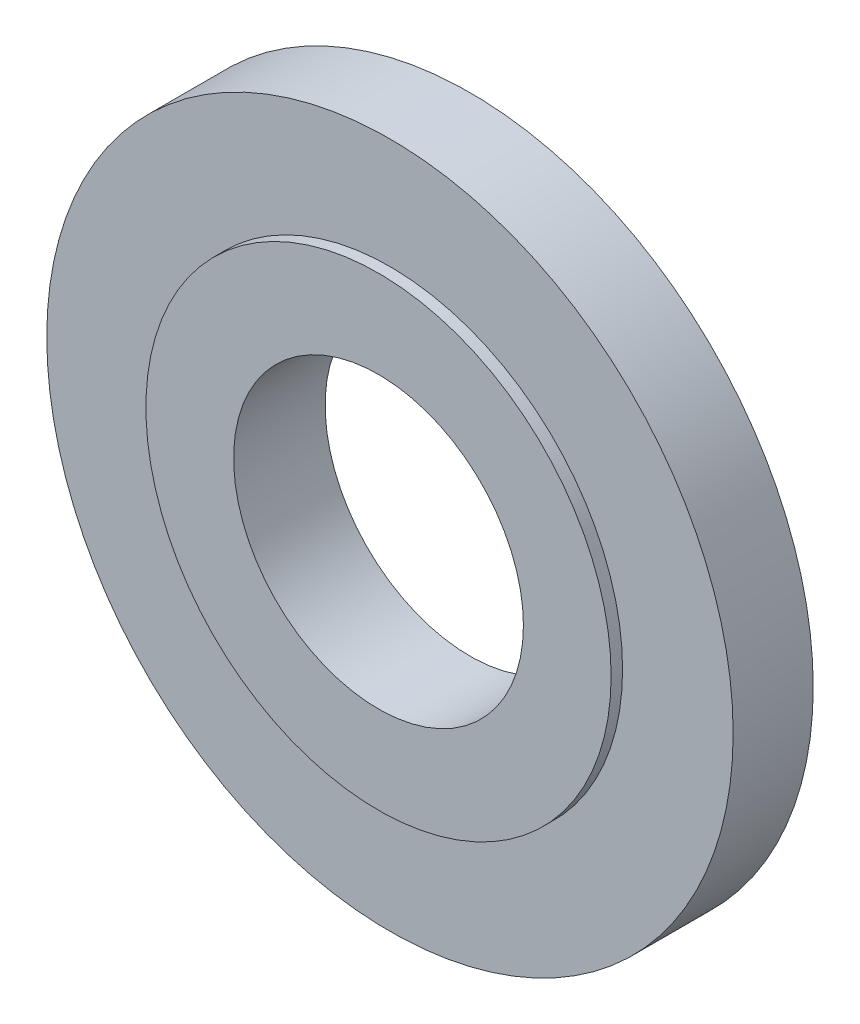
ISO-10303-21;
HEADER;
FILE_DESCRIPTION(('STEP AP214'),'2;1');
FILE_NAME('part.step','',(''),(''),'','','');
FILE_SCHEMA(('AUTOMOTIVE_DESIGN { 1 0 10303 214 1 1 1 1 }'));
ENDSEC;
DATA;
#1=APPLICATION_CONTEXT('core data for automotive mechanical design processes');
#2=APPLICATION_PROTOCOL_DEFINITION('international standard','automotive_design',2000,#1);
#3=PRODUCT_CONTEXT('',#1,'mechanical');
#4=PRODUCT('Part','Part','',(#3));
#5=PRODUCT_RELATED_PRODUCT_CATEGORY('part','',(#4));
#6=PRODUCT_DEFINITION_FORMATION('','',#4);
#7=PRODUCT_DEFINITION_CONTEXT('part definition',#1,'design');
#8=PRODUCT_DEFINITION('design','',#6,#7);
#9=PRODUCT_DEFINITION_SHAPE('','',#8);
#10=(LENGTH_UNIT() NAMED_UNIT(*) SI_UNIT(.MILLI.,.METRE.));
#11=(NAMED_UNIT(*) PLANE_ANGLE_UNIT() SI_UNIT($,.RADIAN.));
#12=(NAMED_UNIT(*) SI_UNIT($,.STERADIAN.) SOLID_ANGLE_UNIT());
#13=UNCERTAINTY_MEASURE_WITH_UNIT(LENGTH_MEASURE(1.E-05),#10,'distance_accuracy_value','');
#14=(GEOMETRIC_REPRESENTATION_CONTEXT(3) GLOBAL_UNCERTAINTY_ASSIGNED_CONTEXT((#13)) GLOBAL_UNIT_ASSIGNED_CONTEXT((#10,
#11,#12)) REPRESENTATION_CONTEXT('',''));
#15=CARTESIAN_POINT('',(0.,0.,0.));
#16=DIRECTION('',(0.,0.,1.));
#17=DIRECTION('',(1.,0.,0.));
#18=AXIS2_PLACEMENT_3D('',#15,#16,#17);
#19=CARTESIAN_POINT('',(0.,0.,-24.));
#20=DIRECTION('',(0.,0.,1.));
#21=DIRECTION('',(1.,0.,0.));
#22=AXIS2_PLACEMENT_3D('',#19,#20,#21);
#23=CYLINDRICAL_SURFACE('',#22,61.);
#24=CARTESIAN_POINT('',(0.,0.,-3.));
#25=DIRECTION('',(0.,0.,1.));
#26=DIRECTION('',(1.,0.,0.));
#27=AXIS2_PLACEMENT_3D('',#24,#25,#26);
#28=CIRCLE('',#27,61.);
#29=CARTESIAN_POINT('',(61.,0.,-3.));
#30=VERTEX_POINT('',#29);
#31=EDGE_CURVE('E10',#30,#30,#28,.F.);
#32=ORIENTED_EDGE('',*,*,#31,.F.);
#33=EDGE_LOOP('',(#32));
#34=FACE_BOUND('',#33,.T.);
#35=CARTESIAN_POINT('',(0.,0.,0.));
#36=DIRECTION('',(0.,0.,1.));
#37=DIRECTION('',(1.,0.,0.));
#38=AXIS2_PLACEMENT_3D('',#35,#36,#37);
#39=CIRCLE('',#38,61.);
#40=CARTESIAN_POINT('',(61.,0.,0.));
#41=VERTEX_POINT('',#40);
#42=EDGE_CURVE('E38',#41,#41,#39,.T.);
#43=ORIENTED_EDGE('',*,*,#42,.F.);
#44=EDGE_LOOP('',(#43));
#45=FACE_BOUND('',#44,.T.);
#46=ADVANCED_FACE('F32',(#34,#45),#23,.T.);
#47=CARTESIAN_POINT('',(0.,0.,0.));
#48=DIRECTION('',(0.,0.,1.));
#49=DIRECTION('',(1.,0.,0.));
#50=AXIS2_PLACEMENT_3D('',#47,#48,#49);
#51=PLANE('',#50);
#52=CARTESIAN_POINT('',(0.,0.,0.));
#53=DIRECTION('',(0.,0.,1.));
#54=DIRECTION('',(1.,0.,0.));
#55=AXIS2_PLACEMENT_3D('',#52,#53,#54);
#56=CIRCLE('',#55,38.);
#57=CARTESIAN_POINT('',(38.,0.,0.));
#58=VERTEX_POINT('',#57);
#59=EDGE_CURVE('E52',#58,#58,#56,.T.);
#60=ORIENTED_EDGE('',*,*,#59,.F.);
#61=EDGE_LOOP('',(#60));
#62=FACE_BOUND('',#61,.T.);
#63=ORIENTED_EDGE('',*,*,#42,.T.);
#64=EDGE_LOOP('',(#63));
#65=FACE_BOUND('',#64,.T.);
#66=ADVANCED_FACE('F67',(#62,#65),#51,.T.);
#67=CARTESIAN_POINT('',(0.,0.,-278.558441227157));
#68=DIRECTION('',(0.,0.,1.));
#69=DIRECTION('',(1.,0.,0.));
#70=AXIS2_PLACEMENT_3D('',#67,#68,#69);
#71=CYLINDRICAL_SURFACE('',#70,90.);
#72=CARTESIAN_POINT('',(0.,0.,-24.));
#73=DIRECTION('',(0.,0.,1.));
#74=DIRECTION('',(1.,0.,0.));
#75=AXIS2_PLACEMENT_3D('',#72,#73,#74);
#76=CIRCLE('',#75,90.);
#77=CARTESIAN_POINT('',(90.,0.,-24.));
#78=VERTEX_POINT('',#77);
#79=EDGE_CURVE('E42',#78,#78,#76,.F.);
#80=ORIENTED_EDGE('',*,*,#79,.F.);
#81=EDGE_LOOP('',(#80));
#82=FACE_BOUND('',#81,.T.);
#83=CARTESIAN_POINT('',(0.,0.,-3.));
#84=DIRECTION('',(0.,0.,1.));
#85=DIRECTION('',(1.,0.,0.));
#86=AXIS2_PLACEMENT_3D('',#83,#84,#85);
#87=CIRCLE('',#86,90.);
#88=CARTESIAN_POINT('',(90.,0.,-3.));
#89=VERTEX_POINT('',#88);
#90=EDGE_CURVE('E46',#89,#89,#87,.T.);
#91=ORIENTED_EDGE('',*,*,#90,.F.);
#92=EDGE_LOOP('',(#91));
#93=FACE_BOUND('',#92,.T.);
#94=ADVANCED_FACE('F69',(#82,#93),#71,.T.);
#95=CARTESIAN_POINT('',(0.,0.,-3.));
#96=DIRECTION('',(0.,0.,1.));
#97=DIRECTION('',(1.,0.,0.));
#98=AXIS2_PLACEMENT_3D('',#95,#96,#97);
#99=PLANE('',#98);
#100=ORIENTED_EDGE('',*,*,#31,.T.);
#101=EDGE_LOOP('',(#100));
#102=FACE_BOUND('',#101,.T.);
#103=ORIENTED_EDGE('',*,*,#90,.T.);
#104=EDGE_LOOP('',(#103));
#105=FACE_BOUND('',#104,.T.);
#106=ADVANCED_FACE('F74',(#102,#105),#99,.T.);
#107=CARTESIAN_POINT('',(0.,0.,-24.));
#108=DIRECTION('',(0.,0.,1.));
#109=DIRECTION('',(1.,0.,0.));
#110=AXIS2_PLACEMENT_3D('',#107,#108,#109);
#111=PLANE('',#110);
#112=CARTESIAN_POINT('',(0.,0.,-24.));
#113=DIRECTION('',(0.,0.,1.));
#114=DIRECTION('',(1.,0.,0.));
#115=AXIS2_PLACEMENT_3D('',#112,#113,#114);
#116=CIRCLE('',#115,38.);
#117=CARTESIAN_POINT('',(38.,0.,-24.));
#118=VERTEX_POINT('',#117);
#119=EDGE_CURVE('E51',#118,#118,#116,.T.);
#120=ORIENTED_EDGE('',*,*,#119,.T.);
#121=EDGE_LOOP('',(#120));
#122=FACE_BOUND('',#121,.T.);
#123=ORIENTED_EDGE('',*,*,#79,.T.);
#124=EDGE_LOOP('',(#123));
#125=FACE_BOUND('',#124,.T.);
#126=ADVANCED_FACE('F58',(#122,#125),#111,.F.);
#127=CARTESIAN_POINT('',(0.,0.,-24.));
#128=DIRECTION('',(0.,0.,1.));
#129=DIRECTION('',(1.,0.,0.));
#130=AXIS2_PLACEMENT_3D('',#127,#128,#129);
#131=CYLINDRICAL_SURFACE('',#130,38.);
#132=ORIENTED_EDGE('',*,*,#119,.F.);
#133=EDGE_LOOP('',(#132));
#134=FACE_BOUND('',#133,.T.);
#135=ORIENTED_EDGE('',*,*,#59,.T.);
#136=EDGE_LOOP('',(#135));
#137=FACE_BOUND('',#136,.T.);
#138=ADVANCED_FACE('F61',(#134,#137),#131,.F.);
#139=CLOSED_SHELL('',(#46,#66,#94,#106,#126,#138));
#140=MANIFOLD_SOLID_BREP('B2',#139);
#141=ADVANCED_BREP_SHAPE_REPRESENTATION('',(#18,#140),#14);
#142=SHAPE_DEFINITION_REPRESENTATION(#9,#141);
ENDSEC;
END-ISO-10303-21;
